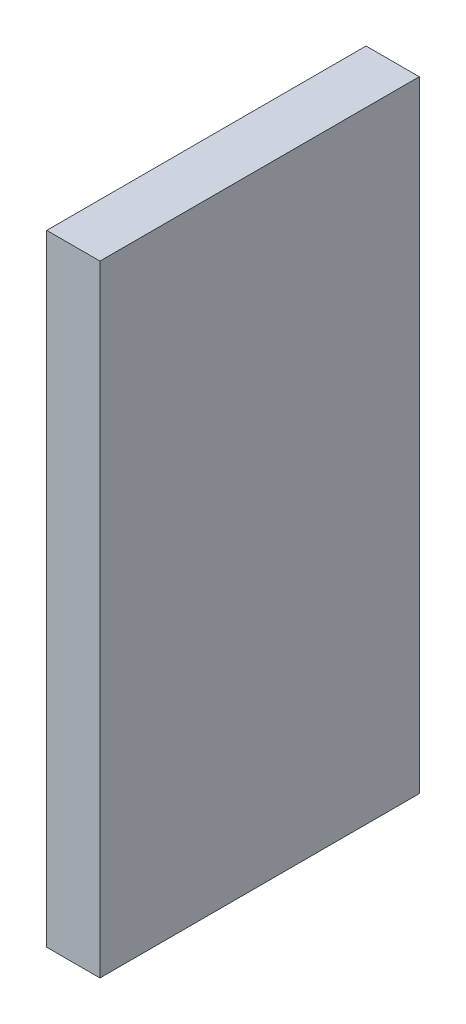
ISO-10303-21;
HEADER;
FILE_DESCRIPTION(('STEP AP214'),'2;1');
FILE_NAME('part.step','',(''),(''),'','','');
FILE_SCHEMA(('AUTOMOTIVE_DESIGN { 1 0 10303 214 1 1 1 1 }'));
ENDSEC;
DATA;
#1=APPLICATION_CONTEXT('core data for automotive mechanical design processes');
#2=APPLICATION_PROTOCOL_DEFINITION('international standard','automotive_design',2000,#1);
#3=PRODUCT_CONTEXT('',#1,'mechanical');
#4=PRODUCT('Part','Part','',(#3));
#5=PRODUCT_RELATED_PRODUCT_CATEGORY('part','',(#4));
#6=PRODUCT_DEFINITION_FORMATION('','',#4);
#7=PRODUCT_DEFINITION_CONTEXT('part definition',#1,'design');
#8=PRODUCT_DEFINITION('design','',#6,#7);
#9=PRODUCT_DEFINITION_SHAPE('','',#8);
#10=(LENGTH_UNIT() NAMED_UNIT(*) SI_UNIT(.MILLI.,.METRE.));
#11=(NAMED_UNIT(*) PLANE_ANGLE_UNIT() SI_UNIT($,.RADIAN.));
#12=(NAMED_UNIT(*) SI_UNIT($,.STERADIAN.) SOLID_ANGLE_UNIT());
#13=UNCERTAINTY_MEASURE_WITH_UNIT(LENGTH_MEASURE(1.E-05),#10,'distance_accuracy_value','');
#14=(GEOMETRIC_REPRESENTATION_CONTEXT(3) GLOBAL_UNCERTAINTY_ASSIGNED_CONTEXT((#13)) GLOBAL_UNIT_ASSIGNED_CONTEXT((#10,
#11,#12)) REPRESENTATION_CONTEXT('',''));
#15=CARTESIAN_POINT('',(0.,0.,0.));
#16=DIRECTION('',(0.,0.,1.));
#17=DIRECTION('',(1.,0.,0.));
#18=AXIS2_PLACEMENT_3D('',#15,#16,#17);
#19=CARTESIAN_POINT('',(3.,-17.5,-8.9999999998986));
#20=DIRECTION('',(0.,1.,0.));
#21=DIRECTION('',(0.,0.,1.));
#22=AXIS2_PLACEMENT_3D('',#19,#20,#21);
#23=PLANE('',#22);
#24=DIRECTION('',(0.,0.,-1.));
#25=VECTOR('',#24,1.);
#26=CARTESIAN_POINT('',(0.,-17.5,-8.9999999998986));
#27=LINE('',#26,#25);
#28=CARTESIAN_POINT('',(0.,-17.5,9.));
#29=VERTEX_POINT('',#28);
#30=CARTESIAN_POINT('',(0.,-17.5,-8.9999999998986));
#31=VERTEX_POINT('',#30);
#32=EDGE_CURVE('E95',#29,#31,#27,.T.);
#33=ORIENTED_EDGE('',*,*,#32,.T.);
#34=DIRECTION('',(-1.,0.,0.));
#35=VECTOR('',#34,1.);
#36=CARTESIAN_POINT('',(3.,-17.5,-8.9999999998986));
#37=LINE('',#36,#35);
#38=CARTESIAN_POINT('',(3.,-17.5,-8.9999999998986));
#39=VERTEX_POINT('',#38);
#40=EDGE_CURVE('E11',#39,#31,#37,.T.);
#41=ORIENTED_EDGE('',*,*,#40,.F.);
#42=DIRECTION('',(0.,0.,-1.));
#43=VECTOR('',#42,1.);
#44=CARTESIAN_POINT('',(3.,-17.5,-8.9999999998986));
#45=LINE('',#44,#43);
#46=CARTESIAN_POINT('',(3.,-17.5,9.));
#47=VERTEX_POINT('',#46);
#48=EDGE_CURVE('E83',#47,#39,#45,.T.);
#49=ORIENTED_EDGE('',*,*,#48,.F.);
#50=DIRECTION('',(-1.,0.,0.));
#51=VECTOR('',#50,1.);
#52=CARTESIAN_POINT('',(3.,-17.5,9.));
#53=LINE('',#52,#51);
#54=EDGE_CURVE('E91',#47,#29,#53,.T.);
#55=ORIENTED_EDGE('',*,*,#54,.T.);
#56=EDGE_LOOP('',(#33,#41,#49,#55));
#57=FACE_BOUND('',#56,.T.);
#58=ADVANCED_FACE('F32',(#57),#23,.F.);
#59=CARTESIAN_POINT('',(3.,17.5,-8.9999999998986));
#60=DIRECTION('',(0.,0.,1.));
#61=DIRECTION('',(1.,0.,0.));
#62=AXIS2_PLACEMENT_3D('',#59,#60,#61);
#63=PLANE('',#62);
#64=DIRECTION('',(0.,1.,0.));
#65=VECTOR('',#64,1.);
#66=CARTESIAN_POINT('',(0.,17.5,-8.9999999998986));
#67=LINE('',#66,#65);
#68=CARTESIAN_POINT('',(0.,17.5,-8.9999999998986));
#69=VERTEX_POINT('',#68);
#70=EDGE_CURVE('E87',#31,#69,#67,.T.);
#71=ORIENTED_EDGE('',*,*,#70,.T.);
#72=DIRECTION('',(-1.,0.,0.));
#73=VECTOR('',#72,1.);
#74=CARTESIAN_POINT('',(3.,17.5,-8.9999999998986));
#75=LINE('',#74,#73);
#76=CARTESIAN_POINT('',(3.,17.5,-8.9999999998986));
#77=VERTEX_POINT('',#76);
#78=EDGE_CURVE('E40',#77,#69,#75,.T.);
#79=ORIENTED_EDGE('',*,*,#78,.F.);
#80=DIRECTION('',(0.,1.,0.));
#81=VECTOR('',#80,1.);
#82=CARTESIAN_POINT('',(3.,17.5,-8.9999999998986));
#83=LINE('',#82,#81);
#84=EDGE_CURVE('E78',#39,#77,#83,.T.);
#85=ORIENTED_EDGE('',*,*,#84,.F.);
#86=ORIENTED_EDGE('',*,*,#40,.T.);
#87=EDGE_LOOP('',(#71,#79,#85,#86));
#88=FACE_BOUND('',#87,.T.);
#89=ADVANCED_FACE('F86',(#88),#63,.F.);
#90=CARTESIAN_POINT('',(3.,17.5,9.));
#91=DIRECTION('',(0.,-1.,0.));
#92=DIRECTION('',(0.,0.,-1.));
#93=AXIS2_PLACEMENT_3D('',#90,#91,#92);
#94=PLANE('',#93);
#95=DIRECTION('',(0.,0.,1.));
#96=VECTOR('',#95,1.);
#97=CARTESIAN_POINT('',(0.,17.5,9.));
#98=LINE('',#97,#96);
#99=CARTESIAN_POINT('',(0.,17.5,9.));
#100=VERTEX_POINT('',#99);
#101=EDGE_CURVE('E65',#69,#100,#98,.T.);
#102=ORIENTED_EDGE('',*,*,#101,.T.);
#103=DIRECTION('',(-1.,0.,0.));
#104=VECTOR('',#103,1.);
#105=CARTESIAN_POINT('',(3.,17.5,9.));
#106=LINE('',#105,#104);
#107=CARTESIAN_POINT('',(3.,17.5,9.));
#108=VERTEX_POINT('',#107);
#109=EDGE_CURVE('E88',#108,#100,#106,.T.);
#110=ORIENTED_EDGE('',*,*,#109,.F.);
#111=DIRECTION('',(0.,0.,1.));
#112=VECTOR('',#111,1.);
#113=CARTESIAN_POINT('',(3.,17.5,9.));
#114=LINE('',#113,#112);
#115=EDGE_CURVE('E81',#77,#108,#114,.T.);
#116=ORIENTED_EDGE('',*,*,#115,.F.);
#117=ORIENTED_EDGE('',*,*,#78,.T.);
#118=EDGE_LOOP('',(#102,#110,#116,#117));
#119=FACE_BOUND('',#118,.T.);
#120=ADVANCED_FACE('F89',(#119),#94,.F.);
#121=CARTESIAN_POINT('',(3.,-17.5,9.));
#122=DIRECTION('',(0.,0.,-1.));
#123=DIRECTION('',(-1.,0.,0.));
#124=AXIS2_PLACEMENT_3D('',#121,#122,#123);
#125=PLANE('',#124);
#126=DIRECTION('',(0.,-1.,0.));
#127=VECTOR('',#126,1.);
#128=CARTESIAN_POINT('',(0.,-17.5,9.));
#129=LINE('',#128,#127);
#130=EDGE_CURVE('E71',#100,#29,#129,.T.);
#131=ORIENTED_EDGE('',*,*,#130,.T.);
#132=ORIENTED_EDGE('',*,*,#54,.F.);
#133=DIRECTION('',(0.,-1.,0.));
#134=VECTOR('',#133,1.);
#135=CARTESIAN_POINT('',(3.,-17.5,9.));
#136=LINE('',#135,#134);
#137=EDGE_CURVE('E48',#108,#47,#136,.T.);
#138=ORIENTED_EDGE('',*,*,#137,.F.);
#139=ORIENTED_EDGE('',*,*,#109,.T.);
#140=EDGE_LOOP('',(#131,#132,#138,#139));
#141=FACE_BOUND('',#140,.T.);
#142=ADVANCED_FACE('F102',(#141),#125,.F.);
#143=CARTESIAN_POINT('',(3.,0.,0.));
#144=DIRECTION('',(-1.,0.,0.));
#145=DIRECTION('',(0.,0.,1.));
#146=AXIS2_PLACEMENT_3D('',#143,#144,#145);
#147=PLANE('',#146);
#148=ORIENTED_EDGE('',*,*,#48,.T.);
#149=ORIENTED_EDGE('',*,*,#84,.T.);
#150=ORIENTED_EDGE('',*,*,#115,.T.);
#151=ORIENTED_EDGE('',*,*,#137,.T.);
#152=EDGE_LOOP('',(#148,#149,#150,#151));
#153=FACE_BOUND('',#152,.T.);
#154=ADVANCED_FACE('F79',(#153),#147,.F.);
#155=CARTESIAN_POINT('',(0.,0.,0.));
#156=DIRECTION('',(-1.,0.,0.));
#157=DIRECTION('',(0.,0.,1.));
#158=AXIS2_PLACEMENT_3D('',#155,#156,#157);
#159=PLANE('',#158);
#160=ORIENTED_EDGE('',*,*,#32,.F.);
#161=ORIENTED_EDGE('',*,*,#130,.F.);
#162=ORIENTED_EDGE('',*,*,#101,.F.);
#163=ORIENTED_EDGE('',*,*,#70,.F.);
#164=EDGE_LOOP('',(#160,#161,#162,#163));
#165=FACE_BOUND('',#164,.T.);
#166=ADVANCED_FACE('F105',(#165),#159,.T.);
#167=CLOSED_SHELL('',(#58,#89,#120,#142,#154,#166));
#168=MANIFOLD_SOLID_BREP('B2',#167);
#169=ADVANCED_BREP_SHAPE_REPRESENTATION('',(#18,#168),#14);
#170=SHAPE_DEFINITION_REPRESENTATION(#9,#169);
ENDSEC;
END-ISO-10303-21;
